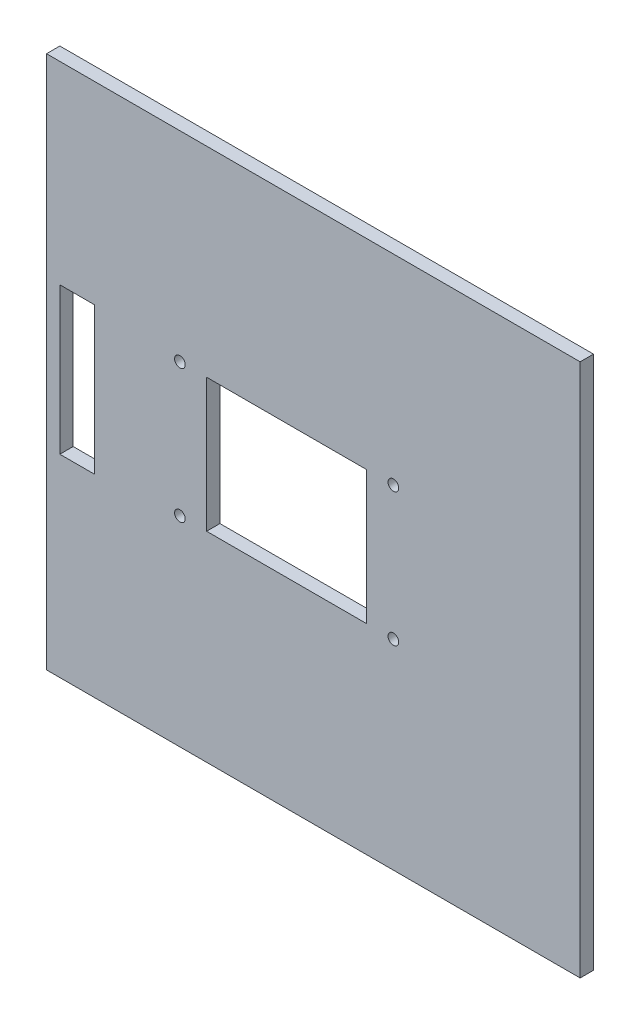
ISO-10303-21;
HEADER;
FILE_DESCRIPTION(('STEP AP214'),'2;1');
FILE_NAME('part.step','',(''),(''),'','','');
FILE_SCHEMA(('AUTOMOTIVE_DESIGN { 1 0 10303 214 1 1 1 1 }'));
ENDSEC;
DATA;
#1=APPLICATION_CONTEXT('core data for automotive mechanical design processes');
#2=APPLICATION_PROTOCOL_DEFINITION('international standard','automotive_design',2000,#1);
#3=PRODUCT_CONTEXT('',#1,'mechanical');
#4=PRODUCT('Part','Part','',(#3));
#5=PRODUCT_RELATED_PRODUCT_CATEGORY('part','',(#4));
#6=PRODUCT_DEFINITION_FORMATION('','',#4);
#7=PRODUCT_DEFINITION_CONTEXT('part definition',#1,'design');
#8=PRODUCT_DEFINITION('design','',#6,#7);
#9=PRODUCT_DEFINITION_SHAPE('','',#8);
#10=(LENGTH_UNIT() NAMED_UNIT(*) SI_UNIT(.MILLI.,.METRE.));
#11=(NAMED_UNIT(*) PLANE_ANGLE_UNIT() SI_UNIT($,.RADIAN.));
#12=(NAMED_UNIT(*) SI_UNIT($,.STERADIAN.) SOLID_ANGLE_UNIT());
#13=UNCERTAINTY_MEASURE_WITH_UNIT(LENGTH_MEASURE(1.E-05),#10,'distance_accuracy_value','');
#14=(GEOMETRIC_REPRESENTATION_CONTEXT(3) GLOBAL_UNCERTAINTY_ASSIGNED_CONTEXT((#13)) GLOBAL_UNIT_ASSIGNED_CONTEXT((#10,
#11,#12)) REPRESENTATION_CONTEXT('',''));
#15=CARTESIAN_POINT('',(0.,0.,0.));
#16=DIRECTION('',(0.,0.,1.));
#17=DIRECTION('',(1.,0.,0.));
#18=AXIS2_PLACEMENT_3D('',#15,#16,#17);
#19=CARTESIAN_POINT('',(0.,0.,5.));
#20=DIRECTION('',(1.,0.,0.));
#21=DIRECTION('',(0.,0.,-1.));
#22=AXIS2_PLACEMENT_3D('',#19,#20,#21);
#23=PLANE('',#22);
#24=DIRECTION('',(0.,-1.,0.));
#25=VECTOR('',#24,1.);
#26=CARTESIAN_POINT('',(0.,0.,0.));
#27=LINE('',#26,#25);
#28=CARTESIAN_POINT('',(0.,200.,0.));
#29=VERTEX_POINT('',#28);
#30=CARTESIAN_POINT('',(0.,0.,0.));
#31=VERTEX_POINT('',#30);
#32=EDGE_CURVE('E192',#29,#31,#27,.T.);
#33=ORIENTED_EDGE('',*,*,#32,.T.);
#34=DIRECTION('',(0.,0.,-1.));
#35=VECTOR('',#34,1.);
#36=CARTESIAN_POINT('',(0.,0.,5.));
#37=LINE('',#36,#35);
#38=CARTESIAN_POINT('',(0.,0.,5.));
#39=VERTEX_POINT('',#38);
#40=EDGE_CURVE('E209',#39,#31,#37,.T.);
#41=ORIENTED_EDGE('',*,*,#40,.F.);
#42=DIRECTION('',(0.,-1.,0.));
#43=VECTOR('',#42,1.);
#44=CARTESIAN_POINT('',(0.,0.,5.));
#45=LINE('',#44,#43);
#46=CARTESIAN_POINT('',(0.,200.,5.));
#47=VERTEX_POINT('',#46);
#48=EDGE_CURVE('E181',#47,#39,#45,.T.);
#49=ORIENTED_EDGE('',*,*,#48,.F.);
#50=DIRECTION('',(0.,0.,-1.));
#51=VECTOR('',#50,1.);
#52=CARTESIAN_POINT('',(0.,200.,5.));
#53=LINE('',#52,#51);
#54=EDGE_CURVE('E191',#47,#29,#53,.T.);
#55=ORIENTED_EDGE('',*,*,#54,.T.);
#56=EDGE_LOOP('',(#33,#41,#49,#55));
#57=FACE_BOUND('',#56,.T.);
#58=ADVANCED_FACE('F33',(#57),#23,.F.);
#59=CARTESIAN_POINT('',(0.,0.,5.));
#60=DIRECTION('',(0.,1.,0.));
#61=DIRECTION('',(0.,0.,1.));
#62=AXIS2_PLACEMENT_3D('',#59,#60,#61);
#63=PLANE('',#62);
#64=DIRECTION('',(1.,0.,0.));
#65=VECTOR('',#64,1.);
#66=CARTESIAN_POINT('',(0.,0.,0.));
#67=LINE('',#66,#65);
#68=CARTESIAN_POINT('',(200.,0.,0.));
#69=VERTEX_POINT('',#68);
#70=EDGE_CURVE('E195',#31,#69,#67,.T.);
#71=ORIENTED_EDGE('',*,*,#70,.T.);
#72=DIRECTION('',(0.,0.,-1.));
#73=VECTOR('',#72,1.);
#74=CARTESIAN_POINT('',(200.,0.,5.));
#75=LINE('',#74,#73);
#76=CARTESIAN_POINT('',(200.,0.,5.));
#77=VERTEX_POINT('',#76);
#78=EDGE_CURVE('E206',#77,#69,#75,.T.);
#79=ORIENTED_EDGE('',*,*,#78,.F.);
#80=DIRECTION('',(1.,0.,0.));
#81=VECTOR('',#80,1.);
#82=CARTESIAN_POINT('',(0.,0.,5.));
#83=LINE('',#82,#81);
#84=EDGE_CURVE('E184',#39,#77,#83,.T.);
#85=ORIENTED_EDGE('',*,*,#84,.F.);
#86=ORIENTED_EDGE('',*,*,#40,.T.);
#87=EDGE_LOOP('',(#71,#79,#85,#86));
#88=FACE_BOUND('',#87,.T.);
#89=ADVANCED_FACE('F256',(#88),#63,.F.);
#90=CARTESIAN_POINT('',(200.,0.,5.));
#91=DIRECTION('',(-1.,0.,0.));
#92=DIRECTION('',(0.,0.,1.));
#93=AXIS2_PLACEMENT_3D('',#90,#91,#92);
#94=PLANE('',#93);
#95=DIRECTION('',(0.,1.,0.));
#96=VECTOR('',#95,1.);
#97=CARTESIAN_POINT('',(200.,0.,0.));
#98=LINE('',#97,#96);
#99=CARTESIAN_POINT('',(200.,200.,0.));
#100=VERTEX_POINT('',#99);
#101=EDGE_CURVE('E198',#69,#100,#98,.T.);
#102=ORIENTED_EDGE('',*,*,#101,.T.);
#103=DIRECTION('',(0.,0.,-1.));
#104=VECTOR('',#103,1.);
#105=CARTESIAN_POINT('',(200.,200.,5.));
#106=LINE('',#105,#104);
#107=CARTESIAN_POINT('',(200.,200.,5.));
#108=VERTEX_POINT('',#107);
#109=EDGE_CURVE('E203',#108,#100,#106,.T.);
#110=ORIENTED_EDGE('',*,*,#109,.F.);
#111=DIRECTION('',(0.,1.,0.));
#112=VECTOR('',#111,1.);
#113=CARTESIAN_POINT('',(200.,0.,5.));
#114=LINE('',#113,#112);
#115=EDGE_CURVE('E187',#77,#108,#114,.T.);
#116=ORIENTED_EDGE('',*,*,#115,.F.);
#117=ORIENTED_EDGE('',*,*,#78,.T.);
#118=EDGE_LOOP('',(#102,#110,#116,#117));
#119=FACE_BOUND('',#118,.T.);
#120=ADVANCED_FACE('F261',(#119),#94,.F.);
#121=CARTESIAN_POINT('',(0.,200.,5.));
#122=DIRECTION('',(0.,-1.,0.));
#123=DIRECTION('',(0.,0.,-1.));
#124=AXIS2_PLACEMENT_3D('',#121,#122,#123);
#125=PLANE('',#124);
#126=DIRECTION('',(-1.,0.,0.));
#127=VECTOR('',#126,1.);
#128=CARTESIAN_POINT('',(0.,200.,0.));
#129=LINE('',#128,#127);
#130=EDGE_CURVE('E185',#100,#29,#129,.T.);
#131=ORIENTED_EDGE('',*,*,#130,.T.);
#132=ORIENTED_EDGE('',*,*,#54,.F.);
#133=DIRECTION('',(-1.,0.,0.));
#134=VECTOR('',#133,1.);
#135=CARTESIAN_POINT('',(0.,200.,5.));
#136=LINE('',#135,#134);
#137=EDGE_CURVE('E189',#108,#47,#136,.T.);
#138=ORIENTED_EDGE('',*,*,#137,.F.);
#139=ORIENTED_EDGE('',*,*,#109,.T.);
#140=EDGE_LOOP('',(#131,#132,#138,#139));
#141=FACE_BOUND('',#140,.T.);
#142=ADVANCED_FACE('F276',(#141),#125,.F.);
#143=CARTESIAN_POINT('',(0.,0.,5.));
#144=DIRECTION('',(0.,0.,-1.));
#145=DIRECTION('',(-1.,0.,0.));
#146=AXIS2_PLACEMENT_3D('',#143,#144,#145);
#147=PLANE('',#146);
#148=DIRECTION('',(1.,0.,0.));
#149=VECTOR('',#148,1.);
#150=CARTESIAN_POINT('',(60.,75.,5.));
#151=LINE('',#150,#149);
#152=CARTESIAN_POINT('',(60.,75.,5.));
#153=VERTEX_POINT('',#152);
#154=CARTESIAN_POINT('',(120.,75.,5.));
#155=VERTEX_POINT('',#154);
#156=EDGE_CURVE('E132',#153,#155,#151,.T.);
#157=ORIENTED_EDGE('',*,*,#156,.F.);
#158=DIRECTION('',(0.,-1.,0.));
#159=VECTOR('',#158,1.);
#160=CARTESIAN_POINT('',(60.,125.,5.));
#161=LINE('',#160,#159);
#162=CARTESIAN_POINT('',(60.,125.,5.));
#163=VERTEX_POINT('',#162);
#164=EDGE_CURVE('E47',#163,#153,#161,.T.);
#165=ORIENTED_EDGE('',*,*,#164,.F.);
#166=DIRECTION('',(-1.,0.,0.));
#167=VECTOR('',#166,1.);
#168=CARTESIAN_POINT('',(60.,125.,5.));
#169=LINE('',#168,#167);
#170=CARTESIAN_POINT('',(120.,125.,5.));
#171=VERTEX_POINT('',#170);
#172=EDGE_CURVE('E139',#171,#163,#169,.T.);
#173=ORIENTED_EDGE('',*,*,#172,.F.);
#174=DIRECTION('',(0.,1.,0.));
#175=VECTOR('',#174,1.);
#176=CARTESIAN_POINT('',(120.,125.,5.));
#177=LINE('',#176,#175);
#178=EDGE_CURVE('E123',#155,#171,#177,.T.);
#179=ORIENTED_EDGE('',*,*,#178,.F.);
#180=EDGE_LOOP('',(#157,#165,#173,#179));
#181=FACE_BOUND('',#180,.T.);
#182=DIRECTION('',(1.,0.,0.));
#183=VECTOR('',#182,1.);
#184=CARTESIAN_POINT('',(5.00000000000002,72.5,5.));
#185=LINE('',#184,#183);
#186=CARTESIAN_POINT('',(5.00000000000002,72.5,5.));
#187=VERTEX_POINT('',#186);
#188=CARTESIAN_POINT('',(18.,72.5,5.));
#189=VERTEX_POINT('',#188);
#190=EDGE_CURVE('E150',#187,#189,#185,.T.);
#191=ORIENTED_EDGE('',*,*,#190,.F.);
#192=DIRECTION('',(0.,-1.,0.));
#193=VECTOR('',#192,1.);
#194=CARTESIAN_POINT('',(5.,127.5,5.));
#195=LINE('',#194,#193);
#196=CARTESIAN_POINT('',(5.,127.5,5.));
#197=VERTEX_POINT('',#196);
#198=EDGE_CURVE('E146',#197,#187,#195,.T.);
#199=ORIENTED_EDGE('',*,*,#198,.F.);
#200=DIRECTION('',(-1.,0.,0.));
#201=VECTOR('',#200,1.);
#202=CARTESIAN_POINT('',(5.,127.5,5.));
#203=LINE('',#202,#201);
#204=CARTESIAN_POINT('',(18.,127.5,5.));
#205=VERTEX_POINT('',#204);
#206=EDGE_CURVE('E156',#205,#197,#203,.T.);
#207=ORIENTED_EDGE('',*,*,#206,.F.);
#208=DIRECTION('',(0.,1.,0.));
#209=VECTOR('',#208,1.);
#210=CARTESIAN_POINT('',(18.,127.5,5.));
#211=LINE('',#210,#209);
#212=EDGE_CURVE('E153',#189,#205,#211,.T.);
#213=ORIENTED_EDGE('',*,*,#212,.F.);
#214=EDGE_LOOP('',(#191,#199,#207,#213));
#215=FACE_BOUND('',#214,.T.);
#216=CARTESIAN_POINT('',(50.,75.,5.));
#217=DIRECTION('',(0.,0.,1.));
#218=DIRECTION('',(1.,0.,0.));
#219=AXIS2_PLACEMENT_3D('',#216,#217,#218);
#220=CIRCLE('',#219,2.);
#221=CARTESIAN_POINT('',(52.,75.,5.));
#222=VERTEX_POINT('',#221);
#223=EDGE_CURVE('E172',#222,#222,#220,.T.);
#224=ORIENTED_EDGE('',*,*,#223,.F.);
#225=EDGE_LOOP('',(#224));
#226=FACE_BOUND('',#225,.T.);
#227=CARTESIAN_POINT('',(130.,125.,5.));
#228=DIRECTION('',(0.,0.,1.));
#229=DIRECTION('',(1.,0.,0.));
#230=AXIS2_PLACEMENT_3D('',#227,#228,#229);
#231=CIRCLE('',#230,2.);
#232=CARTESIAN_POINT('',(132.,125.,5.));
#233=VERTEX_POINT('',#232);
#234=EDGE_CURVE('E171',#233,#233,#231,.T.);
#235=ORIENTED_EDGE('',*,*,#234,.F.);
#236=EDGE_LOOP('',(#235));
#237=FACE_BOUND('',#236,.T.);
#238=CARTESIAN_POINT('',(130.,75.,5.));
#239=DIRECTION('',(0.,0.,1.));
#240=DIRECTION('',(1.,0.,0.));
#241=AXIS2_PLACEMENT_3D('',#238,#239,#240);
#242=CIRCLE('',#241,2.);
#243=CARTESIAN_POINT('',(132.,75.,5.));
#244=VERTEX_POINT('',#243);
#245=EDGE_CURVE('E162',#244,#244,#242,.T.);
#246=ORIENTED_EDGE('',*,*,#245,.F.);
#247=EDGE_LOOP('',(#246));
#248=FACE_BOUND('',#247,.T.);
#249=CARTESIAN_POINT('',(50.,125.,5.));
#250=DIRECTION('',(0.,0.,1.));
#251=DIRECTION('',(1.,0.,0.));
#252=AXIS2_PLACEMENT_3D('',#249,#250,#251);
#253=CIRCLE('',#252,2.);
#254=CARTESIAN_POINT('',(52.,125.,5.));
#255=VERTEX_POINT('',#254);
#256=EDGE_CURVE('E175',#255,#255,#253,.T.);
#257=ORIENTED_EDGE('',*,*,#256,.F.);
#258=EDGE_LOOP('',(#257));
#259=FACE_BOUND('',#258,.T.);
#260=ORIENTED_EDGE('',*,*,#48,.T.);
#261=ORIENTED_EDGE('',*,*,#84,.T.);
#262=ORIENTED_EDGE('',*,*,#115,.T.);
#263=ORIENTED_EDGE('',*,*,#137,.T.);
#264=EDGE_LOOP('',(#260,#261,#262,#263));
#265=FACE_BOUND('',#264,.T.);
#266=ADVANCED_FACE('F136',(#181,#215,#226,#237,#248,#259,#265),#147,.F.);
#267=CARTESIAN_POINT('',(0.,0.,0.));
#268=DIRECTION('',(0.,0.,-1.));
#269=DIRECTION('',(-1.,0.,0.));
#270=AXIS2_PLACEMENT_3D('',#267,#268,#269);
#271=PLANE('',#270);
#272=DIRECTION('',(0.,1.,0.));
#273=VECTOR('',#272,1.);
#274=CARTESIAN_POINT('',(60.,0.,0.));
#275=LINE('',#274,#273);
#276=CARTESIAN_POINT('',(60.,75.,0.));
#277=VERTEX_POINT('',#276);
#278=CARTESIAN_POINT('',(60.,125.,0.));
#279=VERTEX_POINT('',#278);
#280=EDGE_CURVE('E11',#277,#279,#275,.T.);
#281=ORIENTED_EDGE('',*,*,#280,.F.);
#282=DIRECTION('',(-1.,0.,0.));
#283=VECTOR('',#282,1.);
#284=CARTESIAN_POINT('',(0.,75.,0.));
#285=LINE('',#284,#283);
#286=CARTESIAN_POINT('',(120.,75.,0.));
#287=VERTEX_POINT('',#286);
#288=EDGE_CURVE('E231',#287,#277,#285,.T.);
#289=ORIENTED_EDGE('',*,*,#288,.F.);
#290=DIRECTION('',(0.,-1.,0.));
#291=VECTOR('',#290,1.);
#292=CARTESIAN_POINT('',(120.,0.,0.));
#293=LINE('',#292,#291);
#294=CARTESIAN_POINT('',(120.,125.,0.));
#295=VERTEX_POINT('',#294);
#296=EDGE_CURVE('E126',#295,#287,#293,.T.);
#297=ORIENTED_EDGE('',*,*,#296,.F.);
#298=DIRECTION('',(1.,0.,0.));
#299=VECTOR('',#298,1.);
#300=CARTESIAN_POINT('',(0.,125.,0.));
#301=LINE('',#300,#299);
#302=EDGE_CURVE('E40',#279,#295,#301,.T.);
#303=ORIENTED_EDGE('',*,*,#302,.F.);
#304=EDGE_LOOP('',(#281,#289,#297,#303));
#305=FACE_BOUND('',#304,.T.);
#306=DIRECTION('',(0.,1.,0.));
#307=VECTOR('',#306,1.);
#308=CARTESIAN_POINT('',(5.00000000000003,0.,0.));
#309=LINE('',#308,#307);
#310=CARTESIAN_POINT('',(5.00000000000002,72.5,0.));
#311=VERTEX_POINT('',#310);
#312=CARTESIAN_POINT('',(5.,127.5,0.));
#313=VERTEX_POINT('',#312);
#314=EDGE_CURVE('E229',#311,#313,#309,.T.);
#315=ORIENTED_EDGE('',*,*,#314,.F.);
#316=DIRECTION('',(-1.,0.,0.));
#317=VECTOR('',#316,1.);
#318=CARTESIAN_POINT('',(0.,72.5,0.));
#319=LINE('',#318,#317);
#320=CARTESIAN_POINT('',(18.,72.5,0.));
#321=VERTEX_POINT('',#320);
#322=EDGE_CURVE('E212',#321,#311,#319,.T.);
#323=ORIENTED_EDGE('',*,*,#322,.F.);
#324=DIRECTION('',(0.,-1.,0.));
#325=VECTOR('',#324,1.);
#326=CARTESIAN_POINT('',(18.,0.,0.));
#327=LINE('',#326,#325);
#328=CARTESIAN_POINT('',(18.,127.5,0.));
#329=VERTEX_POINT('',#328);
#330=EDGE_CURVE('E224',#329,#321,#327,.T.);
#331=ORIENTED_EDGE('',*,*,#330,.F.);
#332=DIRECTION('',(1.,0.,0.));
#333=VECTOR('',#332,1.);
#334=CARTESIAN_POINT('',(0.,127.5,0.));
#335=LINE('',#334,#333);
#336=EDGE_CURVE('E227',#313,#329,#335,.T.);
#337=ORIENTED_EDGE('',*,*,#336,.F.);
#338=EDGE_LOOP('',(#315,#323,#331,#337));
#339=FACE_BOUND('',#338,.T.);
#340=CARTESIAN_POINT('',(50.,75.,0.));
#341=DIRECTION('',(0.,0.,-1.));
#342=DIRECTION('',(-1.,0.,0.));
#343=AXIS2_PLACEMENT_3D('',#340,#341,#342);
#344=CIRCLE('',#343,2.);
#345=CARTESIAN_POINT('',(48.,75.,0.));
#346=VERTEX_POINT('',#345);
#347=EDGE_CURVE('E196',#346,#346,#344,.T.);
#348=ORIENTED_EDGE('',*,*,#347,.F.);
#349=EDGE_LOOP('',(#348));
#350=FACE_BOUND('',#349,.T.);
#351=CARTESIAN_POINT('',(130.,125.,0.));
#352=DIRECTION('',(0.,0.,-1.));
#353=DIRECTION('',(-1.,0.,0.));
#354=AXIS2_PLACEMENT_3D('',#351,#352,#353);
#355=CIRCLE('',#354,2.);
#356=CARTESIAN_POINT('',(128.,125.,0.));
#357=VERTEX_POINT('',#356);
#358=EDGE_CURVE('E218',#357,#357,#355,.T.);
#359=ORIENTED_EDGE('',*,*,#358,.F.);
#360=EDGE_LOOP('',(#359));
#361=FACE_BOUND('',#360,.T.);
#362=CARTESIAN_POINT('',(130.,75.,0.));
#363=DIRECTION('',(0.,0.,-1.));
#364=DIRECTION('',(-1.,0.,0.));
#365=AXIS2_PLACEMENT_3D('',#362,#363,#364);
#366=CIRCLE('',#365,2.);
#367=CARTESIAN_POINT('',(128.,75.,0.));
#368=VERTEX_POINT('',#367);
#369=EDGE_CURVE('E215',#368,#368,#366,.T.);
#370=ORIENTED_EDGE('',*,*,#369,.F.);
#371=EDGE_LOOP('',(#370));
#372=FACE_BOUND('',#371,.T.);
#373=CARTESIAN_POINT('',(50.,125.,0.));
#374=DIRECTION('',(0.,0.,-1.));
#375=DIRECTION('',(-1.,0.,0.));
#376=AXIS2_PLACEMENT_3D('',#373,#374,#375);
#377=CIRCLE('',#376,2.);
#378=CARTESIAN_POINT('',(48.,125.,0.));
#379=VERTEX_POINT('',#378);
#380=EDGE_CURVE('E180',#379,#379,#377,.T.);
#381=ORIENTED_EDGE('',*,*,#380,.F.);
#382=EDGE_LOOP('',(#381));
#383=FACE_BOUND('',#382,.T.);
#384=ORIENTED_EDGE('',*,*,#32,.F.);
#385=ORIENTED_EDGE('',*,*,#130,.F.);
#386=ORIENTED_EDGE('',*,*,#101,.F.);
#387=ORIENTED_EDGE('',*,*,#70,.F.);
#388=EDGE_LOOP('',(#384,#385,#386,#387));
#389=FACE_BOUND('',#388,.T.);
#390=ADVANCED_FACE('F239',(#305,#339,#350,#361,#372,#383,#389),#271,.T.);
#391=CARTESIAN_POINT('',(50.,125.,-5.));
#392=DIRECTION('',(0.,0.,1.));
#393=DIRECTION('',(1.,0.,0.));
#394=AXIS2_PLACEMENT_3D('',#391,#392,#393);
#395=CYLINDRICAL_SURFACE('',#394,2.);
#396=ORIENTED_EDGE('',*,*,#380,.T.);
#397=EDGE_LOOP('',(#396));
#398=FACE_BOUND('',#397,.T.);
#399=ORIENTED_EDGE('',*,*,#256,.T.);
#400=EDGE_LOOP('',(#399));
#401=FACE_BOUND('',#400,.T.);
#402=ADVANCED_FACE('F287',(#398,#401),#395,.F.);
#403=CARTESIAN_POINT('',(130.,75.,-5.));
#404=DIRECTION('',(0.,0.,1.));
#405=DIRECTION('',(1.,0.,0.));
#406=AXIS2_PLACEMENT_3D('',#403,#404,#405);
#407=CYLINDRICAL_SURFACE('',#406,2.);
#408=ORIENTED_EDGE('',*,*,#369,.T.);
#409=EDGE_LOOP('',(#408));
#410=FACE_BOUND('',#409,.T.);
#411=ORIENTED_EDGE('',*,*,#245,.T.);
#412=EDGE_LOOP('',(#411));
#413=FACE_BOUND('',#412,.T.);
#414=ADVANCED_FACE('F292',(#410,#413),#407,.F.);
#415=CARTESIAN_POINT('',(130.,125.,-5.));
#416=DIRECTION('',(0.,0.,1.));
#417=DIRECTION('',(1.,0.,0.));
#418=AXIS2_PLACEMENT_3D('',#415,#416,#417);
#419=CYLINDRICAL_SURFACE('',#418,2.);
#420=ORIENTED_EDGE('',*,*,#358,.T.);
#421=EDGE_LOOP('',(#420));
#422=FACE_BOUND('',#421,.T.);
#423=ORIENTED_EDGE('',*,*,#234,.T.);
#424=EDGE_LOOP('',(#423));
#425=FACE_BOUND('',#424,.T.);
#426=ADVANCED_FACE('F294',(#422,#425),#419,.F.);
#427=CARTESIAN_POINT('',(50.,75.,-5.));
#428=DIRECTION('',(0.,0.,1.));
#429=DIRECTION('',(1.,0.,0.));
#430=AXIS2_PLACEMENT_3D('',#427,#428,#429);
#431=CYLINDRICAL_SURFACE('',#430,2.);
#432=ORIENTED_EDGE('',*,*,#347,.T.);
#433=EDGE_LOOP('',(#432));
#434=FACE_BOUND('',#433,.T.);
#435=ORIENTED_EDGE('',*,*,#223,.T.);
#436=EDGE_LOOP('',(#435));
#437=FACE_BOUND('',#436,.T.);
#438=ADVANCED_FACE('F297',(#434,#437),#431,.F.);
#439=CARTESIAN_POINT('',(5.,127.5,-5.));
#440=DIRECTION('',(-1.,0.,0.));
#441=DIRECTION('',(0.,-1.,0.));
#442=AXIS2_PLACEMENT_3D('',#439,#440,#441);
#443=PLANE('',#442);
#444=ORIENTED_EDGE('',*,*,#314,.T.);
#445=DIRECTION('',(0.,0.,1.));
#446=VECTOR('',#445,1.);
#447=CARTESIAN_POINT('',(5.,127.5,-5.));
#448=LINE('',#447,#446);
#449=EDGE_CURVE('E160',#313,#197,#448,.T.);
#450=ORIENTED_EDGE('',*,*,#449,.T.);
#451=ORIENTED_EDGE('',*,*,#198,.T.);
#452=DIRECTION('',(0.,0.,1.));
#453=VECTOR('',#452,1.);
#454=CARTESIAN_POINT('',(5.00000000000002,72.5,-5.));
#455=LINE('',#454,#453);
#456=EDGE_CURVE('E159',#311,#187,#455,.T.);
#457=ORIENTED_EDGE('',*,*,#456,.F.);
#458=EDGE_LOOP('',(#444,#450,#451,#457));
#459=FACE_BOUND('',#458,.T.);
#460=ADVANCED_FACE('F301',(#459),#443,.F.);
#461=CARTESIAN_POINT('',(5.,127.5,-5.));
#462=DIRECTION('',(0.,1.,0.));
#463=DIRECTION('',(0.,0.,1.));
#464=AXIS2_PLACEMENT_3D('',#461,#462,#463);
#465=PLANE('',#464);
#466=ORIENTED_EDGE('',*,*,#336,.T.);
#467=DIRECTION('',(0.,0.,1.));
#468=VECTOR('',#467,1.);
#469=CARTESIAN_POINT('',(18.,127.5,-5.));
#470=LINE('',#469,#468);
#471=EDGE_CURVE('E163',#329,#205,#470,.T.);
#472=ORIENTED_EDGE('',*,*,#471,.T.);
#473=ORIENTED_EDGE('',*,*,#206,.T.);
#474=ORIENTED_EDGE('',*,*,#449,.F.);
#475=EDGE_LOOP('',(#466,#472,#473,#474));
#476=FACE_BOUND('',#475,.T.);
#477=ADVANCED_FACE('F307',(#476),#465,.F.);
#478=CARTESIAN_POINT('',(18.,127.5,-5.));
#479=DIRECTION('',(1.,0.,0.));
#480=DIRECTION('',(0.,1.,0.));
#481=AXIS2_PLACEMENT_3D('',#478,#479,#480);
#482=PLANE('',#481);
#483=ORIENTED_EDGE('',*,*,#330,.T.);
#484=DIRECTION('',(0.,0.,1.));
#485=VECTOR('',#484,1.);
#486=CARTESIAN_POINT('',(18.,72.5,-5.));
#487=LINE('',#486,#485);
#488=EDGE_CURVE('E165',#321,#189,#487,.T.);
#489=ORIENTED_EDGE('',*,*,#488,.T.);
#490=ORIENTED_EDGE('',*,*,#212,.T.);
#491=ORIENTED_EDGE('',*,*,#471,.F.);
#492=EDGE_LOOP('',(#483,#489,#490,#491));
#493=FACE_BOUND('',#492,.T.);
#494=ADVANCED_FACE('F250',(#493),#482,.F.);
#495=CARTESIAN_POINT('',(5.00000000000002,72.5,-5.));
#496=DIRECTION('',(0.,-1.,0.));
#497=DIRECTION('',(0.,0.,-1.));
#498=AXIS2_PLACEMENT_3D('',#495,#496,#497);
#499=PLANE('',#498);
#500=ORIENTED_EDGE('',*,*,#322,.T.);
#501=ORIENTED_EDGE('',*,*,#456,.T.);
#502=ORIENTED_EDGE('',*,*,#190,.T.);
#503=ORIENTED_EDGE('',*,*,#488,.F.);
#504=EDGE_LOOP('',(#500,#501,#502,#503));
#505=FACE_BOUND('',#504,.T.);
#506=ADVANCED_FACE('F243',(#505),#499,.F.);
#507=CARTESIAN_POINT('',(60.,125.,-7.));
#508=DIRECTION('',(-1.,0.,0.));
#509=DIRECTION('',(0.,0.,1.));
#510=AXIS2_PLACEMENT_3D('',#507,#508,#509);
#511=PLANE('',#510);
#512=ORIENTED_EDGE('',*,*,#280,.T.);
#513=DIRECTION('',(0.,0.,1.));
#514=VECTOR('',#513,1.);
#515=CARTESIAN_POINT('',(60.,125.,-7.));
#516=LINE('',#515,#514);
#517=EDGE_CURVE('E144',#279,#163,#516,.T.);
#518=ORIENTED_EDGE('',*,*,#517,.T.);
#519=ORIENTED_EDGE('',*,*,#164,.T.);
#520=DIRECTION('',(0.,0.,1.));
#521=VECTOR('',#520,1.);
#522=CARTESIAN_POINT('',(60.,75.,-7.));
#523=LINE('',#522,#521);
#524=EDGE_CURVE('E129',#277,#153,#523,.T.);
#525=ORIENTED_EDGE('',*,*,#524,.F.);
#526=EDGE_LOOP('',(#512,#518,#519,#525));
#527=FACE_BOUND('',#526,.T.);
#528=ADVANCED_FACE('F241',(#527),#511,.F.);
#529=CARTESIAN_POINT('',(60.,125.,-7.));
#530=DIRECTION('',(0.,1.,0.));
#531=DIRECTION('',(0.,0.,1.));
#532=AXIS2_PLACEMENT_3D('',#529,#530,#531);
#533=PLANE('',#532);
#534=ORIENTED_EDGE('',*,*,#302,.T.);
#535=DIRECTION('',(0.,0.,1.));
#536=VECTOR('',#535,1.);
#537=CARTESIAN_POINT('',(120.,125.,-7.));
#538=LINE('',#537,#536);
#539=EDGE_CURVE('E128',#295,#171,#538,.T.);
#540=ORIENTED_EDGE('',*,*,#539,.T.);
#541=ORIENTED_EDGE('',*,*,#172,.T.);
#542=ORIENTED_EDGE('',*,*,#517,.F.);
#543=EDGE_LOOP('',(#534,#540,#541,#542));
#544=FACE_BOUND('',#543,.T.);
#545=ADVANCED_FACE('F236',(#544),#533,.F.);
#546=CARTESIAN_POINT('',(120.,125.,-7.));
#547=DIRECTION('',(1.,0.,0.));
#548=DIRECTION('',(0.,0.,-1.));
#549=AXIS2_PLACEMENT_3D('',#546,#547,#548);
#550=PLANE('',#549);
#551=ORIENTED_EDGE('',*,*,#296,.T.);
#552=DIRECTION('',(0.,0.,1.));
#553=VECTOR('',#552,1.);
#554=CARTESIAN_POINT('',(120.,75.,-7.));
#555=LINE('',#554,#553);
#556=EDGE_CURVE('E55',#287,#155,#555,.T.);
#557=ORIENTED_EDGE('',*,*,#556,.T.);
#558=ORIENTED_EDGE('',*,*,#178,.T.);
#559=ORIENTED_EDGE('',*,*,#539,.F.);
#560=EDGE_LOOP('',(#551,#557,#558,#559));
#561=FACE_BOUND('',#560,.T.);
#562=ADVANCED_FACE('F120',(#561),#550,.F.);
#563=CARTESIAN_POINT('',(60.,75.,-7.));
#564=DIRECTION('',(0.,-1.,0.));
#565=DIRECTION('',(0.,0.,-1.));
#566=AXIS2_PLACEMENT_3D('',#563,#564,#565);
#567=PLANE('',#566);
#568=ORIENTED_EDGE('',*,*,#288,.T.);
#569=ORIENTED_EDGE('',*,*,#524,.T.);
#570=ORIENTED_EDGE('',*,*,#156,.T.);
#571=ORIENTED_EDGE('',*,*,#556,.F.);
#572=EDGE_LOOP('',(#568,#569,#570,#571));
#573=FACE_BOUND('',#572,.T.);
#574=ADVANCED_FACE('F133',(#573),#567,.F.);
#575=CLOSED_SHELL('',(#58,#89,#120,#142,#266,#390,#402,#414,#426,#438,#460,#477,#494,#506,#528,
#545,#562,#574));
#576=MANIFOLD_SOLID_BREP('B2',#575);
#577=ADVANCED_BREP_SHAPE_REPRESENTATION('',(#18,#576),#14);
#578=SHAPE_DEFINITION_REPRESENTATION(#9,#577);
ENDSEC;
END-ISO-10303-21;
